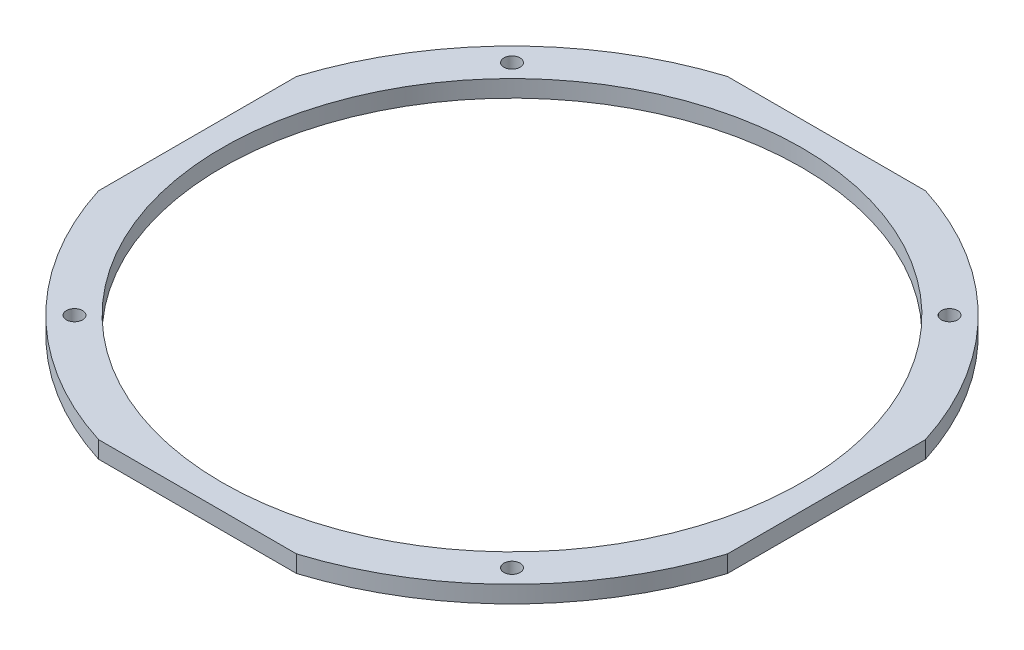
ISO-10303-21;
HEADER;
FILE_DESCRIPTION(('STEP AP214'),'2;1');
FILE_NAME('part.step','',(''),(''),'','','');
FILE_SCHEMA(('AUTOMOTIVE_DESIGN { 1 0 10303 214 1 1 1 1 }'));
ENDSEC;
DATA;
#1=APPLICATION_CONTEXT('core data for automotive mechanical design processes');
#2=APPLICATION_PROTOCOL_DEFINITION('international standard','automotive_design',2000,#1);
#3=PRODUCT_CONTEXT('',#1,'mechanical');
#4=PRODUCT('Part','Part','',(#3));
#5=PRODUCT_RELATED_PRODUCT_CATEGORY('part','',(#4));
#6=PRODUCT_DEFINITION_FORMATION('','',#4);
#7=PRODUCT_DEFINITION_CONTEXT('part definition',#1,'design');
#8=PRODUCT_DEFINITION('design','',#6,#7);
#9=PRODUCT_DEFINITION_SHAPE('','',#8);
#10=(LENGTH_UNIT() NAMED_UNIT(*) SI_UNIT(.MILLI.,.METRE.));
#11=(NAMED_UNIT(*) PLANE_ANGLE_UNIT() SI_UNIT($,.RADIAN.));
#12=(NAMED_UNIT(*) SI_UNIT($,.STERADIAN.) SOLID_ANGLE_UNIT());
#13=UNCERTAINTY_MEASURE_WITH_UNIT(LENGTH_MEASURE(1.E-05),#10,'distance_accuracy_value','');
#14=(GEOMETRIC_REPRESENTATION_CONTEXT(3) GLOBAL_UNCERTAINTY_ASSIGNED_CONTEXT((#13)) GLOBAL_UNIT_ASSIGNED_CONTEXT((#10,
#11,#12)) REPRESENTATION_CONTEXT('',''));
#15=CARTESIAN_POINT('',(0.,0.,0.));
#16=DIRECTION('',(0.,0.,1.));
#17=DIRECTION('',(1.,0.,0.));
#18=AXIS2_PLACEMENT_3D('',#15,#16,#17);
#19=CARTESIAN_POINT('',(0.,3.35,0.));
#20=DIRECTION('',(0.,1.,0.));
#21=DIRECTION('',(0.,0.,1.));
#22=AXIS2_PLACEMENT_3D('',#19,#20,#21);
#23=PLANE('',#22);
#24=CARTESIAN_POINT('',(43.1335136523793,3.35,-43.1335136523795));
#25=DIRECTION('',(0.,1.,0.));
#26=DIRECTION('',(0.,0.,1.));
#27=AXIS2_PLACEMENT_3D('',#24,#25,#26);
#28=CIRCLE('',#27,1.6);
#29=CARTESIAN_POINT('',(43.1335136523793,3.35,-41.5335136523795));
#30=VERTEX_POINT('',#29);
#31=EDGE_CURVE('E211',#30,#30,#28,.T.);
#32=ORIENTED_EDGE('',*,*,#31,.F.);
#33=EDGE_LOOP('',(#32));
#34=FACE_BOUND('',#33,.T.);
#35=CARTESIAN_POINT('',(-43.1335136523796,3.35,-43.1335136523792));
#36=DIRECTION('',(0.,1.,0.));
#37=DIRECTION('',(0.,0.,1.));
#38=AXIS2_PLACEMENT_3D('',#35,#36,#37);
#39=CIRCLE('',#38,1.6);
#40=CARTESIAN_POINT('',(-43.1335136523796,3.35,-41.5335136523792));
#41=VERTEX_POINT('',#40);
#42=EDGE_CURVE('E219',#41,#41,#39,.T.);
#43=ORIENTED_EDGE('',*,*,#42,.F.);
#44=EDGE_LOOP('',(#43));
#45=FACE_BOUND('',#44,.T.);
#46=CARTESIAN_POINT('',(-43.133513652379,3.35,43.1335136523798));
#47=DIRECTION('',(0.,1.,0.));
#48=DIRECTION('',(0.,0.,1.));
#49=AXIS2_PLACEMENT_3D('',#46,#47,#48);
#50=CIRCLE('',#49,1.6);
#51=CARTESIAN_POINT('',(-43.133513652379,3.35,44.7335136523798));
#52=VERTEX_POINT('',#51);
#53=EDGE_CURVE('E227',#52,#52,#50,.T.);
#54=ORIENTED_EDGE('',*,*,#53,.F.);
#55=EDGE_LOOP('',(#54));
#56=FACE_BOUND('',#55,.T.);
#57=CARTESIAN_POINT('',(43.1335136523799,3.35,43.1335136523789));
#58=DIRECTION('',(0.,1.,0.));
#59=DIRECTION('',(0.,0.,1.));
#60=AXIS2_PLACEMENT_3D('',#57,#58,#59);
#61=CIRCLE('',#60,1.6);
#62=CARTESIAN_POINT('',(43.1335136523799,3.35,44.7335136523789));
#63=VERTEX_POINT('',#62);
#64=EDGE_CURVE('E203',#63,#63,#61,.T.);
#65=ORIENTED_EDGE('',*,*,#64,.F.);
#66=EDGE_LOOP('',(#65));
#67=FACE_BOUND('',#66,.T.);
#68=CARTESIAN_POINT('',(0.,3.35,0.));
#69=DIRECTION('',(0.,1.,0.));
#70=DIRECTION('',(0.,0.,1.));
#71=AXIS2_PLACEMENT_3D('',#68,#69,#70);
#72=CIRCLE('',#71,57.15);
#73=CARTESIAN_POINT('',(0.,3.35,57.15));
#74=VERTEX_POINT('',#73);
#75=EDGE_CURVE('E173',#74,#74,#72,.T.);
#76=ORIENTED_EDGE('',*,*,#75,.F.);
#77=EDGE_LOOP('',(#76));
#78=FACE_BOUND('',#77,.T.);
#79=CARTESIAN_POINT('',(0.,3.35,0.));
#80=DIRECTION('',(0.,1.,0.));
#81=DIRECTION('',(0.,0.,1.));
#82=AXIS2_PLACEMENT_3D('',#79,#80,#81);
#83=CIRCLE('',#82,65.);
#84=CARTESIAN_POINT('',(19.5192212959431,3.35,62.));
#85=VERTEX_POINT('',#84);
#86=CARTESIAN_POINT('',(62.,3.35,19.5192212959431));
#87=VERTEX_POINT('',#86);
#88=EDGE_CURVE('E128',#85,#87,#83,.T.);
#89=ORIENTED_EDGE('',*,*,#88,.T.);
#90=DIRECTION('',(0.,0.,-1.));
#91=VECTOR('',#90,1.);
#92=CARTESIAN_POINT('',(62.,3.35,-62.));
#93=LINE('',#92,#91);
#94=CARTESIAN_POINT('',(62.,3.35,-19.5192212959431));
#95=VERTEX_POINT('',#94);
#96=EDGE_CURVE('E112',#87,#95,#93,.T.);
#97=ORIENTED_EDGE('',*,*,#96,.T.);
#98=CARTESIAN_POINT('',(19.5192212959431,3.35,-62.));
#99=VERTEX_POINT('',#98);
#100=EDGE_CURVE('E119',#95,#99,#83,.T.);
#101=ORIENTED_EDGE('',*,*,#100,.T.);
#102=DIRECTION('',(-1.,0.,0.));
#103=VECTOR('',#102,1.);
#104=CARTESIAN_POINT('',(-62.,3.35,-62.));
#105=LINE('',#104,#103);
#106=CARTESIAN_POINT('',(-19.5192212959431,3.35,-62.));
#107=VERTEX_POINT('',#106);
#108=EDGE_CURVE('E101',#99,#107,#105,.T.);
#109=ORIENTED_EDGE('',*,*,#108,.T.);
#110=CARTESIAN_POINT('',(-62.,3.35,-19.5192212959431));
#111=VERTEX_POINT('',#110);
#112=EDGE_CURVE('E129',#107,#111,#83,.T.);
#113=ORIENTED_EDGE('',*,*,#112,.T.);
#114=DIRECTION('',(0.,0.,1.));
#115=VECTOR('',#114,1.);
#116=CARTESIAN_POINT('',(-62.,3.35,-62.));
#117=LINE('',#116,#115);
#118=CARTESIAN_POINT('',(-62.,3.35,19.5192212959431));
#119=VERTEX_POINT('',#118);
#120=EDGE_CURVE('E111',#111,#119,#117,.T.);
#121=ORIENTED_EDGE('',*,*,#120,.T.);
#122=CARTESIAN_POINT('',(-19.5192212959431,3.35,62.));
#123=VERTEX_POINT('',#122);
#124=EDGE_CURVE('E133',#119,#123,#83,.T.);
#125=ORIENTED_EDGE('',*,*,#124,.T.);
#126=DIRECTION('',(1.,0.,0.));
#127=VECTOR('',#126,1.);
#128=CARTESIAN_POINT('',(-62.,3.35,62.));
#129=LINE('',#128,#127);
#130=EDGE_CURVE('E185',#123,#85,#129,.T.);
#131=ORIENTED_EDGE('',*,*,#130,.T.);
#132=EDGE_LOOP('',(#89,#97,#101,#109,#113,#121,#125,#131));
#133=FACE_BOUND('',#132,.T.);
#134=ADVANCED_FACE('F38',(#34,#45,#56,#67,#78,#133),#23,.T.);
#135=CARTESIAN_POINT('',(0.,0.,0.));
#136=DIRECTION('',(0.,1.,0.));
#137=DIRECTION('',(0.,0.,1.));
#138=AXIS2_PLACEMENT_3D('',#135,#136,#137);
#139=PLANE('',#138);
#140=CARTESIAN_POINT('',(43.1335136523793,0.,-43.1335136523795));
#141=DIRECTION('',(0.,1.,0.));
#142=DIRECTION('',(0.,0.,1.));
#143=AXIS2_PLACEMENT_3D('',#140,#141,#142);
#144=CIRCLE('',#143,1.6);
#145=CARTESIAN_POINT('',(43.1335136523793,0.,-41.5335136523795));
#146=VERTEX_POINT('',#145);
#147=EDGE_CURVE('E215',#146,#146,#144,.T.);
#148=ORIENTED_EDGE('',*,*,#147,.T.);
#149=EDGE_LOOP('',(#148));
#150=FACE_BOUND('',#149,.T.);
#151=CARTESIAN_POINT('',(-43.1335136523796,0.,-43.1335136523792));
#152=DIRECTION('',(0.,1.,0.));
#153=DIRECTION('',(0.,0.,1.));
#154=AXIS2_PLACEMENT_3D('',#151,#152,#153);
#155=CIRCLE('',#154,1.6);
#156=CARTESIAN_POINT('',(-43.1335136523796,0.,-41.5335136523792));
#157=VERTEX_POINT('',#156);
#158=EDGE_CURVE('E223',#157,#157,#155,.T.);
#159=ORIENTED_EDGE('',*,*,#158,.T.);
#160=EDGE_LOOP('',(#159));
#161=FACE_BOUND('',#160,.T.);
#162=CARTESIAN_POINT('',(-43.133513652379,0.,43.1335136523798));
#163=DIRECTION('',(0.,1.,0.));
#164=DIRECTION('',(0.,0.,1.));
#165=AXIS2_PLACEMENT_3D('',#162,#163,#164);
#166=CIRCLE('',#165,1.6);
#167=CARTESIAN_POINT('',(-43.133513652379,0.,44.7335136523798));
#168=VERTEX_POINT('',#167);
#169=EDGE_CURVE('E207',#168,#168,#166,.T.);
#170=ORIENTED_EDGE('',*,*,#169,.T.);
#171=EDGE_LOOP('',(#170));
#172=FACE_BOUND('',#171,.T.);
#173=CARTESIAN_POINT('',(43.1335136523799,0.,43.1335136523789));
#174=DIRECTION('',(0.,1.,0.));
#175=DIRECTION('',(0.,0.,1.));
#176=AXIS2_PLACEMENT_3D('',#173,#174,#175);
#177=CIRCLE('',#176,1.6);
#178=CARTESIAN_POINT('',(43.1335136523799,0.,44.7335136523789));
#179=VERTEX_POINT('',#178);
#180=EDGE_CURVE('E194',#179,#179,#177,.T.);
#181=ORIENTED_EDGE('',*,*,#180,.T.);
#182=EDGE_LOOP('',(#181));
#183=FACE_BOUND('',#182,.T.);
#184=CARTESIAN_POINT('',(0.,0.,0.));
#185=DIRECTION('',(0.,1.,0.));
#186=DIRECTION('',(0.,0.,1.));
#187=AXIS2_PLACEMENT_3D('',#184,#185,#186);
#188=CIRCLE('',#187,57.15);
#189=CARTESIAN_POINT('',(0.,0.,57.15));
#190=VERTEX_POINT('',#189);
#191=EDGE_CURVE('E136',#190,#190,#188,.T.);
#192=ORIENTED_EDGE('',*,*,#191,.T.);
#193=EDGE_LOOP('',(#192));
#194=FACE_BOUND('',#193,.T.);
#195=DIRECTION('',(0.,0.,-1.));
#196=VECTOR('',#195,1.);
#197=CARTESIAN_POINT('',(62.,0.,-62.));
#198=LINE('',#197,#196);
#199=CARTESIAN_POINT('',(62.,0.,19.5192212959431));
#200=VERTEX_POINT('',#199);
#201=CARTESIAN_POINT('',(62.,0.,-19.5192212959432));
#202=VERTEX_POINT('',#201);
#203=EDGE_CURVE('E160',#200,#202,#198,.T.);
#204=ORIENTED_EDGE('',*,*,#203,.F.);
#205=CARTESIAN_POINT('',(0.,0.,0.));
#206=DIRECTION('',(0.,1.,0.));
#207=DIRECTION('',(0.,0.,1.));
#208=AXIS2_PLACEMENT_3D('',#205,#206,#207);
#209=CIRCLE('',#208,65.);
#210=CARTESIAN_POINT('',(19.5192212959432,0.,62.));
#211=VERTEX_POINT('',#210);
#212=EDGE_CURVE('E138',#211,#200,#209,.T.);
#213=ORIENTED_EDGE('',*,*,#212,.F.);
#214=DIRECTION('',(1.,0.,0.));
#215=VECTOR('',#214,1.);
#216=CARTESIAN_POINT('',(-62.,0.,62.));
#217=LINE('',#216,#215);
#218=CARTESIAN_POINT('',(-19.5192212959431,0.,62.));
#219=VERTEX_POINT('',#218);
#220=EDGE_CURVE('E183',#219,#211,#217,.T.);
#221=ORIENTED_EDGE('',*,*,#220,.F.);
#222=CARTESIAN_POINT('',(-62.,0.,19.5192212959432));
#223=VERTEX_POINT('',#222);
#224=EDGE_CURVE('E142',#223,#219,#209,.T.);
#225=ORIENTED_EDGE('',*,*,#224,.F.);
#226=DIRECTION('',(0.,0.,1.));
#227=VECTOR('',#226,1.);
#228=CARTESIAN_POINT('',(-62.,0.,-62.));
#229=LINE('',#228,#227);
#230=CARTESIAN_POINT('',(-62.,0.,-19.5192212959431));
#231=VERTEX_POINT('',#230);
#232=EDGE_CURVE('E54',#231,#223,#229,.T.);
#233=ORIENTED_EDGE('',*,*,#232,.F.);
#234=CARTESIAN_POINT('',(-19.5192212959432,0.,-62.));
#235=VERTEX_POINT('',#234);
#236=EDGE_CURVE('E166',#235,#231,#209,.T.);
#237=ORIENTED_EDGE('',*,*,#236,.F.);
#238=DIRECTION('',(-1.,0.,0.));
#239=VECTOR('',#238,1.);
#240=CARTESIAN_POINT('',(-62.,0.,-62.));
#241=LINE('',#240,#239);
#242=CARTESIAN_POINT('',(19.5192212959431,0.,-62.));
#243=VERTEX_POINT('',#242);
#244=EDGE_CURVE('E62',#243,#235,#241,.T.);
#245=ORIENTED_EDGE('',*,*,#244,.F.);
#246=EDGE_CURVE('E121',#202,#243,#209,.T.);
#247=ORIENTED_EDGE('',*,*,#246,.F.);
#248=EDGE_LOOP('',(#204,#213,#221,#225,#233,#237,#245,#247));
#249=FACE_BOUND('',#248,.T.);
#250=ADVANCED_FACE('F162',(#150,#161,#172,#183,#194,#249),#139,.F.);
#251=CARTESIAN_POINT('',(0.,3.35,0.));
#252=DIRECTION('',(0.,-1.,0.));
#253=DIRECTION('',(0.,0.,-1.));
#254=AXIS2_PLACEMENT_3D('',#251,#252,#253);
#255=CYLINDRICAL_SURFACE('',#254,65.);
#256=DIRECTION('',(0.,-1.,0.));
#257=VECTOR('',#256,1.);
#258=CARTESIAN_POINT('',(62.,3.35,19.5192212959432));
#259=LINE('',#258,#257);
#260=EDGE_CURVE('E11',#87,#200,#259,.T.);
#261=ORIENTED_EDGE('',*,*,#260,.F.);
#262=ORIENTED_EDGE('',*,*,#88,.F.);
#263=DIRECTION('',(0.,-1.,0.));
#264=VECTOR('',#263,1.);
#265=CARTESIAN_POINT('',(19.5192212959432,3.35,62.));
#266=LINE('',#265,#264);
#267=EDGE_CURVE('E150',#211,#85,#266,.F.);
#268=ORIENTED_EDGE('',*,*,#267,.F.);
#269=ORIENTED_EDGE('',*,*,#212,.T.);
#270=EDGE_LOOP('',(#261,#262,#268,#269));
#271=FACE_BOUND('',#270,.T.);
#272=ADVANCED_FACE('F40',(#271),#255,.T.);
#273=DIRECTION('',(0.,-1.,0.));
#274=VECTOR('',#273,1.);
#275=CARTESIAN_POINT('',(62.,3.35,-19.5192212959432));
#276=LINE('',#275,#274);
#277=EDGE_CURVE('E47',#202,#95,#276,.F.);
#278=ORIENTED_EDGE('',*,*,#277,.F.);
#279=ORIENTED_EDGE('',*,*,#246,.T.);
#280=DIRECTION('',(0.,-1.,0.));
#281=VECTOR('',#280,1.);
#282=CARTESIAN_POINT('',(19.5192212959432,3.35,-62.));
#283=LINE('',#282,#281);
#284=EDGE_CURVE('E104',#99,#243,#283,.T.);
#285=ORIENTED_EDGE('',*,*,#284,.F.);
#286=ORIENTED_EDGE('',*,*,#100,.F.);
#287=EDGE_LOOP('',(#278,#279,#285,#286));
#288=FACE_BOUND('',#287,.T.);
#289=ADVANCED_FACE('F118',(#288),#255,.T.);
#290=DIRECTION('',(0.,-1.,0.));
#291=VECTOR('',#290,1.);
#292=CARTESIAN_POINT('',(-19.5192212959432,3.35,62.));
#293=LINE('',#292,#291);
#294=EDGE_CURVE('E153',#123,#219,#293,.T.);
#295=ORIENTED_EDGE('',*,*,#294,.F.);
#296=ORIENTED_EDGE('',*,*,#124,.F.);
#297=DIRECTION('',(0.,-1.,0.));
#298=VECTOR('',#297,1.);
#299=CARTESIAN_POINT('',(-62.,3.35,19.5192212959432));
#300=LINE('',#299,#298);
#301=EDGE_CURVE('E123',#223,#119,#300,.F.);
#302=ORIENTED_EDGE('',*,*,#301,.F.);
#303=ORIENTED_EDGE('',*,*,#224,.T.);
#304=EDGE_LOOP('',(#295,#296,#302,#303));
#305=FACE_BOUND('',#304,.T.);
#306=ADVANCED_FACE('F356',(#305),#255,.T.);
#307=DIRECTION('',(0.,-1.,0.));
#308=VECTOR('',#307,1.);
#309=CARTESIAN_POINT('',(-62.,3.35,-19.5192212959432));
#310=LINE('',#309,#308);
#311=EDGE_CURVE('E147',#111,#231,#310,.T.);
#312=ORIENTED_EDGE('',*,*,#311,.F.);
#313=ORIENTED_EDGE('',*,*,#112,.F.);
#314=DIRECTION('',(0.,-1.,0.));
#315=VECTOR('',#314,1.);
#316=CARTESIAN_POINT('',(-19.5192212959432,3.35,-62.));
#317=LINE('',#316,#315);
#318=EDGE_CURVE('E105',#235,#107,#317,.F.);
#319=ORIENTED_EDGE('',*,*,#318,.F.);
#320=ORIENTED_EDGE('',*,*,#236,.T.);
#321=EDGE_LOOP('',(#312,#313,#319,#320));
#322=FACE_BOUND('',#321,.T.);
#323=ADVANCED_FACE('F275',(#322),#255,.T.);
#324=CARTESIAN_POINT('',(0.,3.35,0.));
#325=DIRECTION('',(0.,-1.,0.));
#326=DIRECTION('',(0.,0.,-1.));
#327=AXIS2_PLACEMENT_3D('',#324,#325,#326);
#328=CYLINDRICAL_SURFACE('',#327,57.15);
#329=ORIENTED_EDGE('',*,*,#75,.T.);
#330=EDGE_LOOP('',(#329));
#331=FACE_BOUND('',#330,.T.);
#332=ORIENTED_EDGE('',*,*,#191,.F.);
#333=EDGE_LOOP('',(#332));
#334=FACE_BOUND('',#333,.T.);
#335=ADVANCED_FACE('F272',(#331,#334),#328,.F.);
#336=CARTESIAN_POINT('',(-62.,0.,-62.));
#337=DIRECTION('',(0.,0.,-1.));
#338=DIRECTION('',(-1.,0.,0.));
#339=AXIS2_PLACEMENT_3D('',#336,#337,#338);
#340=PLANE('',#339);
#341=ORIENTED_EDGE('',*,*,#284,.T.);
#342=ORIENTED_EDGE('',*,*,#244,.T.);
#343=ORIENTED_EDGE('',*,*,#318,.T.);
#344=ORIENTED_EDGE('',*,*,#108,.F.);
#345=EDGE_LOOP('',(#341,#342,#343,#344));
#346=FACE_BOUND('',#345,.T.);
#347=ADVANCED_FACE('F103',(#346),#340,.T.);
#348=CARTESIAN_POINT('',(-62.,0.,-62.));
#349=DIRECTION('',(-1.,0.,0.));
#350=DIRECTION('',(0.,0.,1.));
#351=AXIS2_PLACEMENT_3D('',#348,#349,#350);
#352=PLANE('',#351);
#353=ORIENTED_EDGE('',*,*,#311,.T.);
#354=ORIENTED_EDGE('',*,*,#232,.T.);
#355=ORIENTED_EDGE('',*,*,#301,.T.);
#356=ORIENTED_EDGE('',*,*,#120,.F.);
#357=EDGE_LOOP('',(#353,#354,#355,#356));
#358=FACE_BOUND('',#357,.T.);
#359=ADVANCED_FACE('F267',(#358),#352,.T.);
#360=CARTESIAN_POINT('',(-62.,0.,62.));
#361=DIRECTION('',(0.,0.,1.));
#362=DIRECTION('',(1.,0.,0.));
#363=AXIS2_PLACEMENT_3D('',#360,#361,#362);
#364=PLANE('',#363);
#365=ORIENTED_EDGE('',*,*,#294,.T.);
#366=ORIENTED_EDGE('',*,*,#220,.T.);
#367=ORIENTED_EDGE('',*,*,#267,.T.);
#368=ORIENTED_EDGE('',*,*,#130,.F.);
#369=EDGE_LOOP('',(#365,#366,#367,#368));
#370=FACE_BOUND('',#369,.T.);
#371=ADVANCED_FACE('F258',(#370),#364,.T.);
#372=CARTESIAN_POINT('',(62.,0.,-62.));
#373=DIRECTION('',(1.,0.,0.));
#374=DIRECTION('',(0.,0.,-1.));
#375=AXIS2_PLACEMENT_3D('',#372,#373,#374);
#376=PLANE('',#375);
#377=ORIENTED_EDGE('',*,*,#260,.T.);
#378=ORIENTED_EDGE('',*,*,#203,.T.);
#379=ORIENTED_EDGE('',*,*,#277,.T.);
#380=ORIENTED_EDGE('',*,*,#96,.F.);
#381=EDGE_LOOP('',(#377,#378,#379,#380));
#382=FACE_BOUND('',#381,.T.);
#383=ADVANCED_FACE('F157',(#382),#376,.T.);
#384=CARTESIAN_POINT('',(43.1335136523799,0.,43.1335136523789));
#385=DIRECTION('',(0.,1.,0.));
#386=DIRECTION('',(0.,0.,1.));
#387=AXIS2_PLACEMENT_3D('',#384,#385,#386);
#388=CYLINDRICAL_SURFACE('',#387,1.6);
#389=ORIENTED_EDGE('',*,*,#180,.F.);
#390=EDGE_LOOP('',(#389));
#391=FACE_BOUND('',#390,.T.);
#392=ORIENTED_EDGE('',*,*,#64,.T.);
#393=EDGE_LOOP('',(#392));
#394=FACE_BOUND('',#393,.T.);
#395=ADVANCED_FACE('F241',(#391,#394),#388,.F.);
#396=CARTESIAN_POINT('',(-43.133513652379,0.,43.1335136523798));
#397=DIRECTION('',(0.,1.,0.));
#398=DIRECTION('',(0.,0.,1.));
#399=AXIS2_PLACEMENT_3D('',#396,#397,#398);
#400=CYLINDRICAL_SURFACE('',#399,1.6);
#401=ORIENTED_EDGE('',*,*,#169,.F.);
#402=EDGE_LOOP('',(#401));
#403=FACE_BOUND('',#402,.T.);
#404=ORIENTED_EDGE('',*,*,#53,.T.);
#405=EDGE_LOOP('',(#404));
#406=FACE_BOUND('',#405,.T.);
#407=ADVANCED_FACE('F237',(#403,#406),#400,.F.);
#408=CARTESIAN_POINT('',(-43.1335136523796,0.,-43.1335136523792));
#409=DIRECTION('',(0.,1.,0.));
#410=DIRECTION('',(0.,0.,1.));
#411=AXIS2_PLACEMENT_3D('',#408,#409,#410);
#412=CYLINDRICAL_SURFACE('',#411,1.6);
#413=ORIENTED_EDGE('',*,*,#158,.F.);
#414=EDGE_LOOP('',(#413));
#415=FACE_BOUND('',#414,.T.);
#416=ORIENTED_EDGE('',*,*,#42,.T.);
#417=EDGE_LOOP('',(#416));
#418=FACE_BOUND('',#417,.T.);
#419=ADVANCED_FACE('F240',(#415,#418),#412,.F.);
#420=CARTESIAN_POINT('',(43.1335136523793,0.,-43.1335136523795));
#421=DIRECTION('',(0.,1.,0.));
#422=DIRECTION('',(0.,0.,1.));
#423=AXIS2_PLACEMENT_3D('',#420,#421,#422);
#424=CYLINDRICAL_SURFACE('',#423,1.6);
#425=ORIENTED_EDGE('',*,*,#147,.F.);
#426=EDGE_LOOP('',(#425));
#427=FACE_BOUND('',#426,.T.);
#428=ORIENTED_EDGE('',*,*,#31,.T.);
#429=EDGE_LOOP('',(#428));
#430=FACE_BOUND('',#429,.T.);
#431=ADVANCED_FACE('F263',(#427,#430),#424,.F.);
#432=CLOSED_SHELL('',(#134,#250,#272,#289,#306,#323,#335,#347,#359,#371,#383,#395,#407,#419,#431));
#433=MANIFOLD_SOLID_BREP('B2',#432);
#434=ADVANCED_BREP_SHAPE_REPRESENTATION('',(#18,#433),#14);
#435=SHAPE_DEFINITION_REPRESENTATION(#9,#434);
ENDSEC;
END-ISO-10303-21;
